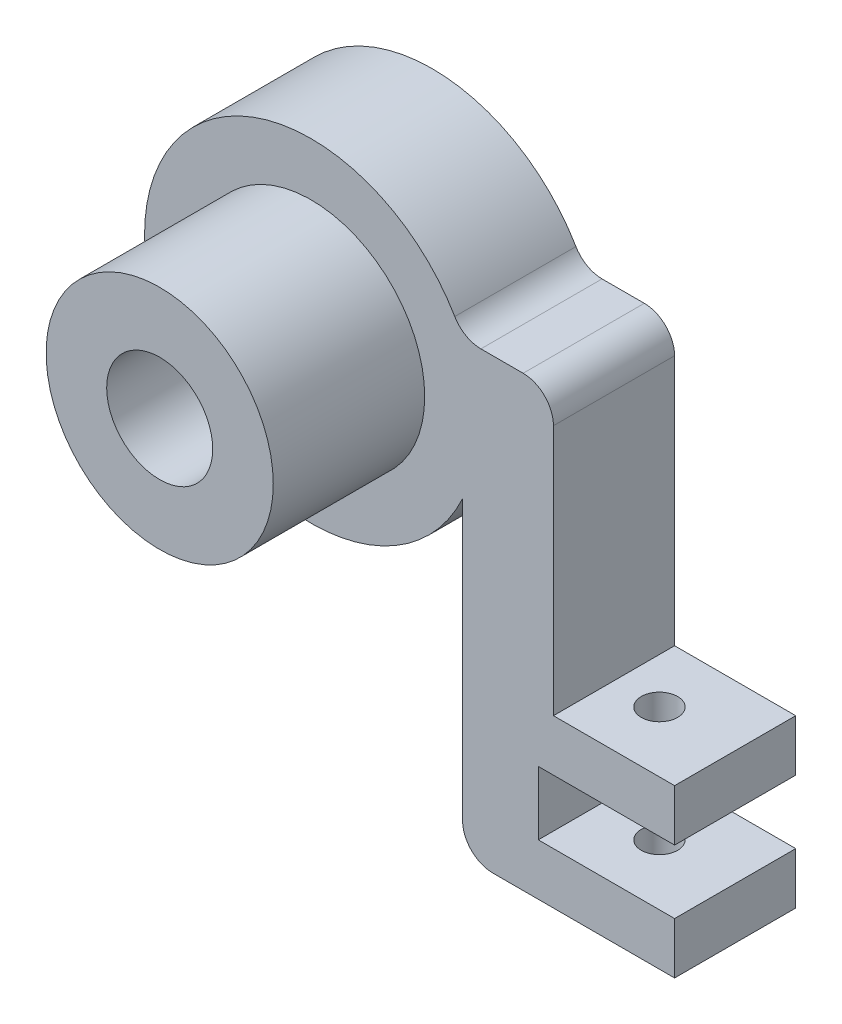
ISO-10303-21;
HEADER;
FILE_DESCRIPTION(('STEP AP214'),'2;1');
FILE_NAME('part.step','',(''),(''),'','','');
FILE_SCHEMA(('AUTOMOTIVE_DESIGN { 1 0 10303 214 1 1 1 1 }'));
ENDSEC;
DATA;
#1=APPLICATION_CONTEXT('core data for automotive mechanical design processes');
#2=APPLICATION_PROTOCOL_DEFINITION('international standard','automotive_design',2000,#1);
#3=PRODUCT_CONTEXT('',#1,'mechanical');
#4=PRODUCT('Part','Part','',(#3));
#5=PRODUCT_RELATED_PRODUCT_CATEGORY('part','',(#4));
#6=PRODUCT_DEFINITION_FORMATION('','',#4);
#7=PRODUCT_DEFINITION_CONTEXT('part definition',#1,'design');
#8=PRODUCT_DEFINITION('design','',#6,#7);
#9=PRODUCT_DEFINITION_SHAPE('','',#8);
#10=(LENGTH_UNIT() NAMED_UNIT(*) SI_UNIT(.MILLI.,.METRE.));
#11=(NAMED_UNIT(*) PLANE_ANGLE_UNIT() SI_UNIT($,.RADIAN.));
#12=(NAMED_UNIT(*) SI_UNIT($,.STERADIAN.) SOLID_ANGLE_UNIT());
#13=UNCERTAINTY_MEASURE_WITH_UNIT(LENGTH_MEASURE(1.E-05),#10,'distance_accuracy_value','');
#14=(GEOMETRIC_REPRESENTATION_CONTEXT(3) GLOBAL_UNCERTAINTY_ASSIGNED_CONTEXT((#13)) GLOBAL_UNIT_ASSIGNED_CONTEXT((#10,
#11,#12)) REPRESENTATION_CONTEXT('',''));
#15=CARTESIAN_POINT('',(0.,0.,0.));
#16=DIRECTION('',(0.,0.,1.));
#17=DIRECTION('',(1.,0.,0.));
#18=AXIS2_PLACEMENT_3D('',#15,#16,#17);
#19=CARTESIAN_POINT('',(35.,-36.,8.));
#20=DIRECTION('',(-1.,0.,0.));
#21=DIRECTION('',(0.,0.,1.));
#22=AXIS2_PLACEMENT_3D('',#19,#20,#21);
#23=PLANE('',#22);
#24=DIRECTION('',(0.,1.,0.));
#25=VECTOR('',#24,1.);
#26=CARTESIAN_POINT('',(35.,-36.,0.));
#27=LINE('',#26,#25);
#28=CARTESIAN_POINT('',(35.,-36.,0.));
#29=VERTEX_POINT('',#28);
#30=CARTESIAN_POINT('',(35.,-32.6,0.));
#31=VERTEX_POINT('',#30);
#32=EDGE_CURVE('E168',#29,#31,#27,.T.);
#33=ORIENTED_EDGE('',*,*,#32,.T.);
#34=DIRECTION('',(0.,0.,-1.));
#35=VECTOR('',#34,1.);
#36=CARTESIAN_POINT('',(35.,-32.6,8.));
#37=LINE('',#36,#35);
#38=CARTESIAN_POINT('',(35.,-32.6,8.));
#39=VERTEX_POINT('',#38);
#40=EDGE_CURVE('E147',#39,#31,#37,.T.);
#41=ORIENTED_EDGE('',*,*,#40,.F.);
#42=DIRECTION('',(0.,1.,0.));
#43=VECTOR('',#42,1.);
#44=CARTESIAN_POINT('',(35.,-36.,8.));
#45=LINE('',#44,#43);
#46=CARTESIAN_POINT('',(35.,-36.,8.));
#47=VERTEX_POINT('',#46);
#48=EDGE_CURVE('E154',#47,#39,#45,.T.);
#49=ORIENTED_EDGE('',*,*,#48,.F.);
#50=DIRECTION('',(0.,0.,-1.));
#51=VECTOR('',#50,1.);
#52=CARTESIAN_POINT('',(35.,-36.,8.));
#53=LINE('',#52,#51);
#54=EDGE_CURVE('E244',#47,#29,#53,.T.);
#55=ORIENTED_EDGE('',*,*,#54,.T.);
#56=EDGE_LOOP('',(#33,#41,#49,#55));
#57=FACE_BOUND('',#56,.T.);
#58=ADVANCED_FACE('F41',(#57),#23,.F.);
#59=CARTESIAN_POINT('',(35.,-32.6,8.));
#60=DIRECTION('',(0.,-1.,0.));
#61=DIRECTION('',(1.,0.,0.));
#62=AXIS2_PLACEMENT_3D('',#59,#60,#61);
#63=PLANE('',#62);
#64=CARTESIAN_POINT('',(30.,-32.6,4.));
#65=DIRECTION('',(0.,-1.,0.));
#66=DIRECTION('',(1.,0.,0.));
#67=AXIS2_PLACEMENT_3D('',#64,#65,#66);
#68=CIRCLE('',#67,1.19999999999999);
#69=CARTESIAN_POINT('',(31.2,-32.6,4.));
#70=VERTEX_POINT('',#69);
#71=EDGE_CURVE('E248',#70,#70,#68,.T.);
#72=ORIENTED_EDGE('',*,*,#71,.T.);
#73=EDGE_LOOP('',(#72));
#74=FACE_BOUND('',#73,.T.);
#75=DIRECTION('',(-1.,0.,0.));
#76=VECTOR('',#75,1.);
#77=CARTESIAN_POINT('',(35.,-32.6,0.));
#78=LINE('',#77,#76);
#79=CARTESIAN_POINT('',(26.,-32.6,0.));
#80=VERTEX_POINT('',#79);
#81=EDGE_CURVE('E247',#31,#80,#78,.T.);
#82=ORIENTED_EDGE('',*,*,#81,.T.);
#83=DIRECTION('',(0.,0.,-1.));
#84=VECTOR('',#83,1.);
#85=CARTESIAN_POINT('',(26.,-32.6,8.));
#86=LINE('',#85,#84);
#87=CARTESIAN_POINT('',(26.,-32.6,8.));
#88=VERTEX_POINT('',#87);
#89=EDGE_CURVE('E150',#88,#80,#86,.T.);
#90=ORIENTED_EDGE('',*,*,#89,.F.);
#91=DIRECTION('',(-1.,0.,0.));
#92=VECTOR('',#91,1.);
#93=CARTESIAN_POINT('',(35.,-32.6,8.));
#94=LINE('',#93,#92);
#95=EDGE_CURVE('E143',#39,#88,#94,.T.);
#96=ORIENTED_EDGE('',*,*,#95,.F.);
#97=ORIENTED_EDGE('',*,*,#40,.T.);
#98=EDGE_LOOP('',(#82,#90,#96,#97));
#99=FACE_BOUND('',#98,.T.);
#100=ADVANCED_FACE('F145',(#74,#99),#63,.F.);
#101=CARTESIAN_POINT('',(26.,-32.6,8.));
#102=DIRECTION('',(-1.,0.,0.));
#103=DIRECTION('',(0.,0.,1.));
#104=AXIS2_PLACEMENT_3D('',#101,#102,#103);
#105=PLANE('',#104);
#106=DIRECTION('',(0.,1.,0.));
#107=VECTOR('',#106,1.);
#108=CARTESIAN_POINT('',(26.,-32.6,0.));
#109=LINE('',#108,#107);
#110=CARTESIAN_POINT('',(26.,-28.4,0.));
#111=VERTEX_POINT('',#110);
#112=EDGE_CURVE('E251',#80,#111,#109,.T.);
#113=ORIENTED_EDGE('',*,*,#112,.T.);
#114=DIRECTION('',(0.,0.,-1.));
#115=VECTOR('',#114,1.);
#116=CARTESIAN_POINT('',(26.,-28.4,8.));
#117=LINE('',#116,#115);
#118=CARTESIAN_POINT('',(26.,-28.4,8.));
#119=VERTEX_POINT('',#118);
#120=EDGE_CURVE('E177',#119,#111,#117,.T.);
#121=ORIENTED_EDGE('',*,*,#120,.F.);
#122=DIRECTION('',(0.,1.,0.));
#123=VECTOR('',#122,1.);
#124=CARTESIAN_POINT('',(26.,-32.6,8.));
#125=LINE('',#124,#123);
#126=EDGE_CURVE('E153',#88,#119,#125,.T.);
#127=ORIENTED_EDGE('',*,*,#126,.F.);
#128=ORIENTED_EDGE('',*,*,#89,.T.);
#129=EDGE_LOOP('',(#113,#121,#127,#128));
#130=FACE_BOUND('',#129,.T.);
#131=ADVANCED_FACE('F406',(#130),#105,.F.);
#132=CARTESIAN_POINT('',(35.,-28.4,8.));
#133=DIRECTION('',(0.,1.,0.));
#134=DIRECTION('',(-1.,0.,0.));
#135=AXIS2_PLACEMENT_3D('',#132,#133,#134);
#136=PLANE('',#135);
#137=CARTESIAN_POINT('',(30.,-28.4,4.));
#138=DIRECTION('',(0.,1.,0.));
#139=DIRECTION('',(-1.,0.,0.));
#140=AXIS2_PLACEMENT_3D('',#137,#138,#139);
#141=CIRCLE('',#140,1.19999999999999);
#142=CARTESIAN_POINT('',(28.8,-28.4,4.));
#143=VERTEX_POINT('',#142);
#144=EDGE_CURVE('E328',#143,#143,#141,.T.);
#145=ORIENTED_EDGE('',*,*,#144,.T.);
#146=EDGE_LOOP('',(#145));
#147=FACE_BOUND('',#146,.T.);
#148=DIRECTION('',(1.,0.,0.));
#149=VECTOR('',#148,1.);
#150=CARTESIAN_POINT('',(35.,-28.4,0.));
#151=LINE('',#150,#149);
#152=CARTESIAN_POINT('',(35.,-28.4,0.));
#153=VERTEX_POINT('',#152);
#154=EDGE_CURVE('E254',#111,#153,#151,.T.);
#155=ORIENTED_EDGE('',*,*,#154,.T.);
#156=DIRECTION('',(0.,0.,-1.));
#157=VECTOR('',#156,1.);
#158=CARTESIAN_POINT('',(35.,-28.4,8.));
#159=LINE('',#158,#157);
#160=CARTESIAN_POINT('',(35.,-28.4,8.));
#161=VERTEX_POINT('',#160);
#162=EDGE_CURVE('E286',#161,#153,#159,.T.);
#163=ORIENTED_EDGE('',*,*,#162,.F.);
#164=DIRECTION('',(1.,0.,0.));
#165=VECTOR('',#164,1.);
#166=CARTESIAN_POINT('',(35.,-28.4,8.));
#167=LINE('',#166,#165);
#168=EDGE_CURVE('E297',#119,#161,#167,.T.);
#169=ORIENTED_EDGE('',*,*,#168,.F.);
#170=ORIENTED_EDGE('',*,*,#120,.T.);
#171=EDGE_LOOP('',(#155,#163,#169,#170));
#172=FACE_BOUND('',#171,.T.);
#173=ADVANCED_FACE('F295',(#147,#172),#136,.F.);
#174=CARTESIAN_POINT('',(35.,-28.4,8.));
#175=DIRECTION('',(-1.,0.,0.));
#176=DIRECTION('',(0.,0.,1.));
#177=AXIS2_PLACEMENT_3D('',#174,#175,#176);
#178=PLANE('',#177);
#179=DIRECTION('',(0.,1.,0.));
#180=VECTOR('',#179,1.);
#181=CARTESIAN_POINT('',(35.,-28.4,0.));
#182=LINE('',#181,#180);
#183=CARTESIAN_POINT('',(35.,-25.,0.));
#184=VERTEX_POINT('',#183);
#185=EDGE_CURVE('E257',#153,#184,#182,.T.);
#186=ORIENTED_EDGE('',*,*,#185,.T.);
#187=DIRECTION('',(0.,0.,-1.));
#188=VECTOR('',#187,1.);
#189=CARTESIAN_POINT('',(35.,-25.,8.));
#190=LINE('',#189,#188);
#191=CARTESIAN_POINT('',(35.,-25.,8.));
#192=VERTEX_POINT('',#191);
#193=EDGE_CURVE('E282',#192,#184,#190,.T.);
#194=ORIENTED_EDGE('',*,*,#193,.F.);
#195=DIRECTION('',(0.,1.,0.));
#196=VECTOR('',#195,1.);
#197=CARTESIAN_POINT('',(35.,-28.4,8.));
#198=LINE('',#197,#196);
#199=EDGE_CURVE('E315',#161,#192,#198,.T.);
#200=ORIENTED_EDGE('',*,*,#199,.F.);
#201=ORIENTED_EDGE('',*,*,#162,.T.);
#202=EDGE_LOOP('',(#186,#194,#200,#201));
#203=FACE_BOUND('',#202,.T.);
#204=ADVANCED_FACE('F305',(#203),#178,.F.);
#205=CARTESIAN_POINT('',(35.,-25.,8.));
#206=DIRECTION('',(0.,-1.,0.));
#207=DIRECTION('',(0.,0.,-1.));
#208=AXIS2_PLACEMENT_3D('',#205,#206,#207);
#209=PLANE('',#208);
#210=CARTESIAN_POINT('',(30.,-25.,4.));
#211=DIRECTION('',(0.,1.,0.));
#212=DIRECTION('',(0.,0.,1.));
#213=AXIS2_PLACEMENT_3D('',#210,#211,#212);
#214=CIRCLE('',#213,1.19999999999999);
#215=CARTESIAN_POINT('',(30.,-25.,5.19999999999999));
#216=VERTEX_POINT('',#215);
#217=EDGE_CURVE('E333',#216,#216,#214,.T.);
#218=ORIENTED_EDGE('',*,*,#217,.F.);
#219=EDGE_LOOP('',(#218));
#220=FACE_BOUND('',#219,.T.);
#221=DIRECTION('',(-1.,0.,0.));
#222=VECTOR('',#221,1.);
#223=CARTESIAN_POINT('',(35.,-25.,0.));
#224=LINE('',#223,#222);
#225=CARTESIAN_POINT('',(27.,-25.,0.));
#226=VERTEX_POINT('',#225);
#227=EDGE_CURVE('E260',#184,#226,#224,.T.);
#228=ORIENTED_EDGE('',*,*,#227,.T.);
#229=DIRECTION('',(0.,0.,-1.));
#230=VECTOR('',#229,1.);
#231=CARTESIAN_POINT('',(27.,-25.,8.));
#232=LINE('',#231,#230);
#233=CARTESIAN_POINT('',(27.,-25.,8.));
#234=VERTEX_POINT('',#233);
#235=EDGE_CURVE('E278',#234,#226,#232,.T.);
#236=ORIENTED_EDGE('',*,*,#235,.F.);
#237=DIRECTION('',(-1.,0.,0.));
#238=VECTOR('',#237,1.);
#239=CARTESIAN_POINT('',(35.,-25.,8.));
#240=LINE('',#239,#238);
#241=EDGE_CURVE('E311',#192,#234,#240,.T.);
#242=ORIENTED_EDGE('',*,*,#241,.F.);
#243=ORIENTED_EDGE('',*,*,#193,.T.);
#244=EDGE_LOOP('',(#228,#236,#242,#243));
#245=FACE_BOUND('',#244,.T.);
#246=ADVANCED_FACE('F309',(#220,#245),#209,.F.);
#247=CARTESIAN_POINT('',(27.,-6.41742430504416,8.));
#248=DIRECTION('',(-1.,0.,0.));
#249=DIRECTION('',(0.,-1.,0.));
#250=AXIS2_PLACEMENT_3D('',#247,#248,#249);
#251=PLANE('',#250);
#252=DIRECTION('',(0.,1.,0.));
#253=VECTOR('',#252,1.);
#254=CARTESIAN_POINT('',(27.,-6.41742430504416,0.));
#255=LINE('',#254,#253);
#256=CARTESIAN_POINT('',(27.,-8.41742430504416,0.));
#257=VERTEX_POINT('',#256);
#258=EDGE_CURVE('E221',#226,#257,#255,.T.);
#259=ORIENTED_EDGE('',*,*,#258,.T.);
#260=DIRECTION('',(0.,0.,-1.));
#261=VECTOR('',#260,1.);
#262=CARTESIAN_POINT('',(27.,-8.41742430504416,8.));
#263=LINE('',#262,#261);
#264=CARTESIAN_POINT('',(27.,-8.41742430504416,8.));
#265=VERTEX_POINT('',#264);
#266=EDGE_CURVE('E205',#257,#265,#263,.F.);
#267=ORIENTED_EDGE('',*,*,#266,.T.);
#268=DIRECTION('',(0.,1.,0.));
#269=VECTOR('',#268,1.);
#270=CARTESIAN_POINT('',(27.,-6.41742430504416,8.));
#271=LINE('',#270,#269);
#272=EDGE_CURVE('E238',#234,#265,#271,.T.);
#273=ORIENTED_EDGE('',*,*,#272,.F.);
#274=ORIENTED_EDGE('',*,*,#235,.T.);
#275=EDGE_LOOP('',(#259,#267,#273,#274));
#276=FACE_BOUND('',#275,.T.);
#277=ADVANCED_FACE('F428',(#276),#251,.F.);
#278=CARTESIAN_POINT('',(21.,-6.41742430504416,8.));
#279=DIRECTION('',(0.,-1.,0.));
#280=DIRECTION('',(0.,0.,-1.));
#281=AXIS2_PLACEMENT_3D('',#278,#279,#280);
#282=PLANE('',#281);
#283=DIRECTION('',(-1.,0.,0.));
#284=VECTOR('',#283,1.);
#285=CARTESIAN_POINT('',(21.,-6.41742430504416,0.));
#286=LINE('',#285,#284);
#287=CARTESIAN_POINT('',(25.,-6.41742430504416,0.));
#288=VERTEX_POINT('',#287);
#289=CARTESIAN_POINT('',(22.2102496502164,-6.41742430504416,0.));
#290=VERTEX_POINT('',#289);
#291=EDGE_CURVE('E213',#288,#290,#286,.T.);
#292=ORIENTED_EDGE('',*,*,#291,.T.);
#293=DIRECTION('',(0.,0.,1.));
#294=VECTOR('',#293,1.);
#295=CARTESIAN_POINT('',(22.2102496502164,-6.41742430504416,8.));
#296=LINE('',#295,#294);
#297=CARTESIAN_POINT('',(22.2102496502164,-6.41742430504416,8.));
#298=VERTEX_POINT('',#297);
#299=EDGE_CURVE('E63',#290,#298,#296,.T.);
#300=ORIENTED_EDGE('',*,*,#299,.T.);
#301=DIRECTION('',(-1.,0.,0.));
#302=VECTOR('',#301,1.);
#303=CARTESIAN_POINT('',(21.,-6.41742430504416,8.));
#304=LINE('',#303,#302);
#305=CARTESIAN_POINT('',(25.,-6.41742430504416,8.));
#306=VERTEX_POINT('',#305);
#307=EDGE_CURVE('E233',#306,#298,#304,.T.);
#308=ORIENTED_EDGE('',*,*,#307,.F.);
#309=DIRECTION('',(0.,0.,-1.));
#310=VECTOR('',#309,1.);
#311=CARTESIAN_POINT('',(25.,-6.41742430504416,8.));
#312=LINE('',#311,#310);
#313=EDGE_CURVE('E199',#306,#288,#312,.T.);
#314=ORIENTED_EDGE('',*,*,#313,.T.);
#315=EDGE_LOOP('',(#292,#300,#308,#314));
#316=FACE_BOUND('',#315,.T.);
#317=ADVANCED_FACE('F218',(#316),#282,.F.);
#318=CARTESIAN_POINT('',(11.,-11.,8.));
#319=DIRECTION('',(0.,0.,-1.));
#320=DIRECTION('',(-1.,0.,0.));
#321=AXIS2_PLACEMENT_3D('',#318,#319,#320);
#322=CYLINDRICAL_SURFACE('',#321,11.);
#323=CARTESIAN_POINT('',(11.,-11.,8.));
#324=DIRECTION('',(0.,0.,1.));
#325=DIRECTION('',(1.,0.,0.));
#326=AXIS2_PLACEMENT_3D('',#323,#324,#325);
#327=CIRCLE('',#326,11.);
#328=CARTESIAN_POINT('',(20.4855958578754,-5.43012825811429,8.));
#329=VERTEX_POINT('',#328);
#330=CARTESIAN_POINT('',(21.,-15.5825756949558,8.));
#331=VERTEX_POINT('',#330);
#332=EDGE_CURVE('E228',#329,#331,#327,.T.);
#333=ORIENTED_EDGE('',*,*,#332,.F.);
#334=DIRECTION('',(0.,0.,-1.));
#335=VECTOR('',#334,1.);
#336=CARTESIAN_POINT('',(20.4855958578754,-5.43012825811429,8.));
#337=LINE('',#336,#335);
#338=CARTESIAN_POINT('',(20.4855958578754,-5.43012825811429,0.));
#339=VERTEX_POINT('',#338);
#340=EDGE_CURVE('E195',#329,#339,#337,.T.);
#341=ORIENTED_EDGE('',*,*,#340,.T.);
#342=CARTESIAN_POINT('',(11.,-11.,0.));
#343=DIRECTION('',(0.,0.,1.));
#344=DIRECTION('',(1.,0.,0.));
#345=AXIS2_PLACEMENT_3D('',#342,#343,#344);
#346=CIRCLE('',#345,11.);
#347=CARTESIAN_POINT('',(21.,-15.5825756949558,0.));
#348=VERTEX_POINT('',#347);
#349=EDGE_CURVE('E215',#339,#348,#346,.T.);
#350=ORIENTED_EDGE('',*,*,#349,.T.);
#351=DIRECTION('',(0.,0.,-1.));
#352=VECTOR('',#351,1.);
#353=CARTESIAN_POINT('',(21.,-15.5825756949558,8.));
#354=LINE('',#353,#352);
#355=EDGE_CURVE('E229',#331,#348,#354,.T.);
#356=ORIENTED_EDGE('',*,*,#355,.F.);
#357=EDGE_LOOP('',(#333,#341,#350,#356));
#358=FACE_BOUND('',#357,.T.);
#359=ADVANCED_FACE('F225',(#358),#322,.T.);
#360=CARTESIAN_POINT('',(21.,-36.,8.));
#361=DIRECTION('',(1.,0.,0.));
#362=DIRECTION('',(0.,1.,0.));
#363=AXIS2_PLACEMENT_3D('',#360,#361,#362);
#364=PLANE('',#363);
#365=DIRECTION('',(0.,-1.,0.));
#366=VECTOR('',#365,1.);
#367=CARTESIAN_POINT('',(21.,-36.,0.));
#368=LINE('',#367,#366);
#369=CARTESIAN_POINT('',(21.,-34.,0.));
#370=VERTEX_POINT('',#369);
#371=EDGE_CURVE('E268',#348,#370,#368,.T.);
#372=ORIENTED_EDGE('',*,*,#371,.T.);
#373=DIRECTION('',(0.,0.,-1.));
#374=VECTOR('',#373,1.);
#375=CARTESIAN_POINT('',(21.,-34.,8.));
#376=LINE('',#375,#374);
#377=CARTESIAN_POINT('',(21.,-34.,8.));
#378=VERTEX_POINT('',#377);
#379=EDGE_CURVE('E186',#370,#378,#376,.F.);
#380=ORIENTED_EDGE('',*,*,#379,.T.);
#381=DIRECTION('',(0.,-1.,0.));
#382=VECTOR('',#381,1.);
#383=CARTESIAN_POINT('',(21.,-36.,8.));
#384=LINE('',#383,#382);
#385=EDGE_CURVE('E232',#331,#378,#384,.T.);
#386=ORIENTED_EDGE('',*,*,#385,.F.);
#387=ORIENTED_EDGE('',*,*,#355,.T.);
#388=EDGE_LOOP('',(#372,#380,#386,#387));
#389=FACE_BOUND('',#388,.T.);
#390=ADVANCED_FACE('F499',(#389),#364,.F.);
#391=CARTESIAN_POINT('',(35.,-36.,8.));
#392=DIRECTION('',(0.,1.,0.));
#393=DIRECTION('',(0.,0.,1.));
#394=AXIS2_PLACEMENT_3D('',#391,#392,#393);
#395=PLANE('',#394);
#396=CARTESIAN_POINT('',(30.,-36.,4.));
#397=DIRECTION('',(0.,1.,0.));
#398=DIRECTION('',(0.,0.,1.));
#399=AXIS2_PLACEMENT_3D('',#396,#397,#398);
#400=CIRCLE('',#399,1.19999999999999);
#401=CARTESIAN_POINT('',(30.,-36.,5.19999999999999));
#402=VERTEX_POINT('',#401);
#403=EDGE_CURVE('E332',#402,#402,#400,.F.);
#404=ORIENTED_EDGE('',*,*,#403,.F.);
#405=EDGE_LOOP('',(#404));
#406=FACE_BOUND('',#405,.T.);
#407=DIRECTION('',(1.,0.,0.));
#408=VECTOR('',#407,1.);
#409=CARTESIAN_POINT('',(35.,-36.,8.));
#410=LINE('',#409,#408);
#411=CARTESIAN_POINT('',(23.,-36.,8.));
#412=VERTEX_POINT('',#411);
#413=EDGE_CURVE('E160',#412,#47,#410,.T.);
#414=ORIENTED_EDGE('',*,*,#413,.F.);
#415=DIRECTION('',(0.,0.,-1.));
#416=VECTOR('',#415,1.);
#417=CARTESIAN_POINT('',(23.,-36.,8.));
#418=LINE('',#417,#416);
#419=CARTESIAN_POINT('',(23.,-36.,0.));
#420=VERTEX_POINT('',#419);
#421=EDGE_CURVE('E170',#412,#420,#418,.T.);
#422=ORIENTED_EDGE('',*,*,#421,.T.);
#423=DIRECTION('',(1.,0.,0.));
#424=VECTOR('',#423,1.);
#425=CARTESIAN_POINT('',(35.,-36.,0.));
#426=LINE('',#425,#424);
#427=EDGE_CURVE('E165',#420,#29,#426,.T.);
#428=ORIENTED_EDGE('',*,*,#427,.T.);
#429=ORIENTED_EDGE('',*,*,#54,.F.);
#430=EDGE_LOOP('',(#414,#422,#428,#429));
#431=FACE_BOUND('',#430,.T.);
#432=ADVANCED_FACE('F507',(#406,#431),#395,.F.);
#433=CARTESIAN_POINT('',(11.,-11.,8.));
#434=DIRECTION('',(0.,0.,1.));
#435=DIRECTION('',(1.,0.,0.));
#436=AXIS2_PLACEMENT_3D('',#433,#434,#435);
#437=PLANE('',#436);
#438=CARTESIAN_POINT('',(11.,-11.,8.));
#439=DIRECTION('',(0.,0.,1.));
#440=DIRECTION('',(1.,0.,0.));
#441=AXIS2_PLACEMENT_3D('',#438,#439,#440);
#442=CIRCLE('',#441,7.5);
#443=CARTESIAN_POINT('',(18.5,-11.,8.));
#444=VERTEX_POINT('',#443);
#445=EDGE_CURVE('E341',#444,#444,#442,.T.);
#446=ORIENTED_EDGE('',*,*,#445,.F.);
#447=EDGE_LOOP('',(#446));
#448=FACE_BOUND('',#447,.T.);
#449=ORIENTED_EDGE('',*,*,#385,.T.);
#450=CARTESIAN_POINT('',(23.,-34.,8.));
#451=DIRECTION('',(0.,0.,1.));
#452=DIRECTION('',(1.,0.,0.));
#453=AXIS2_PLACEMENT_3D('',#450,#451,#452);
#454=CIRCLE('',#453,2.);
#455=EDGE_CURVE('E192',#378,#412,#454,.T.);
#456=ORIENTED_EDGE('',*,*,#455,.T.);
#457=ORIENTED_EDGE('',*,*,#413,.T.);
#458=ORIENTED_EDGE('',*,*,#48,.T.);
#459=ORIENTED_EDGE('',*,*,#95,.T.);
#460=ORIENTED_EDGE('',*,*,#126,.T.);
#461=ORIENTED_EDGE('',*,*,#168,.T.);
#462=ORIENTED_EDGE('',*,*,#199,.T.);
#463=ORIENTED_EDGE('',*,*,#241,.T.);
#464=ORIENTED_EDGE('',*,*,#272,.T.);
#465=CARTESIAN_POINT('',(25.,-8.41742430504416,8.));
#466=DIRECTION('',(0.,0.,1.));
#467=DIRECTION('',(1.,0.,0.));
#468=AXIS2_PLACEMENT_3D('',#465,#466,#467);
#469=CIRCLE('',#468,2.);
#470=EDGE_CURVE('E189',#265,#306,#469,.T.);
#471=ORIENTED_EDGE('',*,*,#470,.T.);
#472=ORIENTED_EDGE('',*,*,#307,.T.);
#473=CARTESIAN_POINT('',(22.2102496502164,-4.41742430504416,8.));
#474=DIRECTION('',(0.,0.,1.));
#475=DIRECTION('',(1.,0.,0.));
#476=AXIS2_PLACEMENT_3D('',#473,#474,#475);
#477=CIRCLE('',#476,2.);
#478=EDGE_CURVE('E12',#298,#329,#477,.F.);
#479=ORIENTED_EDGE('',*,*,#478,.T.);
#480=ORIENTED_EDGE('',*,*,#332,.T.);
#481=EDGE_LOOP('',(#449,#456,#457,#458,#459,#460,#461,#462,#463,#464,#471,#472,#479,#480));
#482=FACE_BOUND('',#481,.T.);
#483=ADVANCED_FACE('F158',(#448,#482),#437,.T.);
#484=CARTESIAN_POINT('',(11.,-11.,0.));
#485=DIRECTION('',(0.,0.,1.));
#486=DIRECTION('',(1.,0.,0.));
#487=AXIS2_PLACEMENT_3D('',#484,#485,#486);
#488=PLANE('',#487);
#489=CARTESIAN_POINT('',(11.,-11.,0.));
#490=DIRECTION('',(0.,0.,-1.));
#491=DIRECTION('',(-1.,0.,0.));
#492=AXIS2_PLACEMENT_3D('',#489,#490,#491);
#493=CIRCLE('',#492,3.5);
#494=CARTESIAN_POINT('',(7.5,-11.,0.));
#495=VERTEX_POINT('',#494);
#496=EDGE_CURVE('E368',#495,#495,#493,.T.);
#497=ORIENTED_EDGE('',*,*,#496,.F.);
#498=EDGE_LOOP('',(#497));
#499=FACE_BOUND('',#498,.T.);
#500=CARTESIAN_POINT('',(11.,-3.5,0.));
#501=DIRECTION('',(0.,0.,-1.));
#502=DIRECTION('',(-1.,0.,0.));
#503=AXIS2_PLACEMENT_3D('',#500,#501,#502);
#504=CIRCLE('',#503,1.);
#505=CARTESIAN_POINT('',(10.,-3.5,0.));
#506=VERTEX_POINT('',#505);
#507=EDGE_CURVE('E353',#506,#506,#504,.T.);
#508=ORIENTED_EDGE('',*,*,#507,.F.);
#509=EDGE_LOOP('',(#508));
#510=FACE_BOUND('',#509,.T.);
#511=CARTESIAN_POINT('',(11.,-18.5,0.));
#512=DIRECTION('',(0.,0.,-1.));
#513=DIRECTION('',(-1.,0.,0.));
#514=AXIS2_PLACEMENT_3D('',#511,#512,#513);
#515=CIRCLE('',#514,1.);
#516=CARTESIAN_POINT('',(10.,-18.5,0.));
#517=VERTEX_POINT('',#516);
#518=EDGE_CURVE('E354',#517,#517,#515,.T.);
#519=ORIENTED_EDGE('',*,*,#518,.F.);
#520=EDGE_LOOP('',(#519));
#521=FACE_BOUND('',#520,.T.);
#522=ORIENTED_EDGE('',*,*,#427,.F.);
#523=CARTESIAN_POINT('',(23.,-34.,0.));
#524=DIRECTION('',(0.,0.,1.));
#525=DIRECTION('',(1.,0.,0.));
#526=AXIS2_PLACEMENT_3D('',#523,#524,#525);
#527=CIRCLE('',#526,2.);
#528=EDGE_CURVE('E183',#420,#370,#527,.F.);
#529=ORIENTED_EDGE('',*,*,#528,.T.);
#530=ORIENTED_EDGE('',*,*,#371,.F.);
#531=ORIENTED_EDGE('',*,*,#349,.F.);
#532=CARTESIAN_POINT('',(22.2102496502164,-4.41742430504416,0.));
#533=DIRECTION('',(0.,0.,1.));
#534=DIRECTION('',(1.,0.,0.));
#535=AXIS2_PLACEMENT_3D('',#532,#533,#534);
#536=CIRCLE('',#535,2.);
#537=EDGE_CURVE('E50',#339,#290,#536,.T.);
#538=ORIENTED_EDGE('',*,*,#537,.T.);
#539=ORIENTED_EDGE('',*,*,#291,.F.);
#540=CARTESIAN_POINT('',(25.,-8.41742430504416,0.));
#541=DIRECTION('',(0.,0.,1.));
#542=DIRECTION('',(1.,0.,0.));
#543=AXIS2_PLACEMENT_3D('',#540,#541,#542);
#544=CIRCLE('',#543,2.);
#545=EDGE_CURVE('E175',#288,#257,#544,.F.);
#546=ORIENTED_EDGE('',*,*,#545,.T.);
#547=ORIENTED_EDGE('',*,*,#258,.F.);
#548=ORIENTED_EDGE('',*,*,#227,.F.);
#549=ORIENTED_EDGE('',*,*,#185,.F.);
#550=ORIENTED_EDGE('',*,*,#154,.F.);
#551=ORIENTED_EDGE('',*,*,#112,.F.);
#552=ORIENTED_EDGE('',*,*,#81,.F.);
#553=ORIENTED_EDGE('',*,*,#32,.F.);
#554=EDGE_LOOP('',(#522,#529,#530,#531,#538,#539,#546,#547,#548,#549,#550,#551,#552,#553));
#555=FACE_BOUND('',#554,.T.);
#556=ADVANCED_FACE('F212',(#499,#510,#521,#555),#488,.F.);
#557=CARTESIAN_POINT('',(30.,-25.,4.));
#558=DIRECTION('',(0.,1.,0.));
#559=DIRECTION('',(0.,0.,1.));
#560=AXIS2_PLACEMENT_3D('',#557,#558,#559);
#561=CYLINDRICAL_SURFACE('',#560,1.19999999999999);
#562=ORIENTED_EDGE('',*,*,#403,.T.);
#563=EDGE_LOOP('',(#562));
#564=FACE_BOUND('',#563,.T.);
#565=ORIENTED_EDGE('',*,*,#71,.F.);
#566=EDGE_LOOP('',(#565));
#567=FACE_BOUND('',#566,.T.);
#568=ADVANCED_FACE('F378',(#564,#567),#561,.F.);
#569=ORIENTED_EDGE('',*,*,#217,.T.);
#570=EDGE_LOOP('',(#569));
#571=FACE_BOUND('',#570,.T.);
#572=ORIENTED_EDGE('',*,*,#144,.F.);
#573=EDGE_LOOP('',(#572));
#574=FACE_BOUND('',#573,.T.);
#575=ADVANCED_FACE('F413',(#571,#574),#561,.F.);
#576=CARTESIAN_POINT('',(23.,-34.,8.));
#577=DIRECTION('',(0.,0.,-1.));
#578=DIRECTION('',(-1.,0.,0.));
#579=AXIS2_PLACEMENT_3D('',#576,#577,#578);
#580=CYLINDRICAL_SURFACE('',#579,2.);
#581=ORIENTED_EDGE('',*,*,#455,.F.);
#582=ORIENTED_EDGE('',*,*,#379,.F.);
#583=ORIENTED_EDGE('',*,*,#528,.F.);
#584=ORIENTED_EDGE('',*,*,#421,.F.);
#585=EDGE_LOOP('',(#581,#582,#583,#584));
#586=FACE_BOUND('',#585,.T.);
#587=ADVANCED_FACE('F411',(#586),#580,.T.);
#588=CARTESIAN_POINT('',(22.2102496502164,-4.41742430504416,8.));
#589=DIRECTION('',(0.,0.,-1.));
#590=DIRECTION('',(-1.,0.,0.));
#591=AXIS2_PLACEMENT_3D('',#588,#589,#590);
#592=CYLINDRICAL_SURFACE('',#591,2.);
#593=ORIENTED_EDGE('',*,*,#478,.F.);
#594=ORIENTED_EDGE('',*,*,#299,.F.);
#595=ORIENTED_EDGE('',*,*,#537,.F.);
#596=ORIENTED_EDGE('',*,*,#340,.F.);
#597=EDGE_LOOP('',(#593,#594,#595,#596));
#598=FACE_BOUND('',#597,.T.);
#599=ADVANCED_FACE('F223',(#598),#592,.F.);
#600=CARTESIAN_POINT('',(25.,-8.41742430504416,8.));
#601=DIRECTION('',(0.,0.,-1.));
#602=DIRECTION('',(-1.,0.,0.));
#603=AXIS2_PLACEMENT_3D('',#600,#601,#602);
#604=CYLINDRICAL_SURFACE('',#603,2.);
#605=ORIENTED_EDGE('',*,*,#470,.F.);
#606=ORIENTED_EDGE('',*,*,#266,.F.);
#607=ORIENTED_EDGE('',*,*,#545,.F.);
#608=ORIENTED_EDGE('',*,*,#313,.F.);
#609=EDGE_LOOP('',(#605,#606,#607,#608));
#610=FACE_BOUND('',#609,.T.);
#611=ADVANCED_FACE('F43',(#610),#604,.T.);
#612=CARTESIAN_POINT('',(11.,-11.,18.));
#613=DIRECTION('',(0.,0.,-1.));
#614=DIRECTION('',(-1.,0.,0.));
#615=AXIS2_PLACEMENT_3D('',#612,#613,#614);
#616=CYLINDRICAL_SURFACE('',#615,7.5);
#617=CARTESIAN_POINT('',(11.,-11.,18.));
#618=DIRECTION('',(0.,0.,1.));
#619=DIRECTION('',(1.,0.,0.));
#620=AXIS2_PLACEMENT_3D('',#617,#618,#619);
#621=CIRCLE('',#620,7.5);
#622=CARTESIAN_POINT('',(18.5,-11.,18.));
#623=VERTEX_POINT('',#622);
#624=EDGE_CURVE('E337',#623,#623,#621,.T.);
#625=ORIENTED_EDGE('',*,*,#624,.F.);
#626=EDGE_LOOP('',(#625));
#627=FACE_BOUND('',#626,.T.);
#628=ORIENTED_EDGE('',*,*,#445,.T.);
#629=EDGE_LOOP('',(#628));
#630=FACE_BOUND('',#629,.T.);
#631=ADVANCED_FACE('F398',(#627,#630),#616,.T.);
#632=CARTESIAN_POINT('',(11.,-11.,18.));
#633=DIRECTION('',(0.,0.,1.));
#634=DIRECTION('',(1.,0.,0.));
#635=AXIS2_PLACEMENT_3D('',#632,#633,#634);
#636=PLANE('',#635);
#637=CARTESIAN_POINT('',(11.,-11.,18.));
#638=DIRECTION('',(0.,0.,1.));
#639=DIRECTION('',(1.,0.,0.));
#640=AXIS2_PLACEMENT_3D('',#637,#638,#639);
#641=CIRCLE('',#640,3.5);
#642=CARTESIAN_POINT('',(14.5,-11.,18.));
#643=VERTEX_POINT('',#642);
#644=EDGE_CURVE('E358',#643,#643,#641,.F.);
#645=ORIENTED_EDGE('',*,*,#644,.T.);
#646=EDGE_LOOP('',(#645));
#647=FACE_BOUND('',#646,.T.);
#648=ORIENTED_EDGE('',*,*,#624,.T.);
#649=EDGE_LOOP('',(#648));
#650=FACE_BOUND('',#649,.T.);
#651=ADVANCED_FACE('F393',(#647,#650),#636,.T.);
#652=CARTESIAN_POINT('',(11.,-11.,6.));
#653=DIRECTION('',(0.,0.,1.));
#654=DIRECTION('',(1.,0.,0.));
#655=AXIS2_PLACEMENT_3D('',#652,#653,#654);
#656=PLANE('',#655);
#657=CARTESIAN_POINT('',(11.,-18.5,6.));
#658=DIRECTION('',(0.,0.,1.));
#659=DIRECTION('',(1.,0.,0.));
#660=AXIS2_PLACEMENT_3D('',#657,#658,#659);
#661=CIRCLE('',#660,1.);
#662=CARTESIAN_POINT('',(12.,-18.5,6.));
#663=VERTEX_POINT('',#662);
#664=EDGE_CURVE('E349',#663,#663,#661,.F.);
#665=ORIENTED_EDGE('',*,*,#664,.T.);
#666=EDGE_LOOP('',(#665));
#667=FACE_BOUND('',#666,.T.);
#668=ADVANCED_FACE('F388',(#667),#656,.F.);
#669=CARTESIAN_POINT('',(11.,-18.5,10.8284271247462));
#670=DIRECTION('',(0.,0.,-1.));
#671=DIRECTION('',(-1.,0.,0.));
#672=AXIS2_PLACEMENT_3D('',#669,#670,#671);
#673=CYLINDRICAL_SURFACE('',#672,1.);
#674=ORIENTED_EDGE('',*,*,#518,.T.);
#675=EDGE_LOOP('',(#674));
#676=FACE_BOUND('',#675,.T.);
#677=ORIENTED_EDGE('',*,*,#664,.F.);
#678=EDGE_LOOP('',(#677));
#679=FACE_BOUND('',#678,.T.);
#680=ADVANCED_FACE('F384',(#676,#679),#673,.F.);
#681=CARTESIAN_POINT('',(11.,-11.,6.));
#682=DIRECTION('',(0.,0.,1.));
#683=DIRECTION('',(1.,0.,0.));
#684=AXIS2_PLACEMENT_3D('',#681,#682,#683);
#685=PLANE('',#684);
#686=CARTESIAN_POINT('',(11.,-3.5,6.));
#687=DIRECTION('',(0.,0.,1.));
#688=DIRECTION('',(1.,0.,0.));
#689=AXIS2_PLACEMENT_3D('',#686,#687,#688);
#690=CIRCLE('',#689,1.);
#691=CARTESIAN_POINT('',(12.,-3.5,6.));
#692=VERTEX_POINT('',#691);
#693=EDGE_CURVE('E345',#692,#692,#690,.F.);
#694=ORIENTED_EDGE('',*,*,#693,.T.);
#695=EDGE_LOOP('',(#694));
#696=FACE_BOUND('',#695,.T.);
#697=ADVANCED_FACE('F387',(#696),#685,.F.);
#698=CARTESIAN_POINT('',(11.,-3.5,10.8284271247462));
#699=DIRECTION('',(0.,0.,-1.));
#700=DIRECTION('',(-1.,0.,0.));
#701=AXIS2_PLACEMENT_3D('',#698,#699,#700);
#702=CYLINDRICAL_SURFACE('',#701,1.);
#703=ORIENTED_EDGE('',*,*,#507,.T.);
#704=EDGE_LOOP('',(#703));
#705=FACE_BOUND('',#704,.T.);
#706=ORIENTED_EDGE('',*,*,#693,.F.);
#707=EDGE_LOOP('',(#706));
#708=FACE_BOUND('',#707,.T.);
#709=ADVANCED_FACE('F565',(#705,#708),#702,.F.);
#710=CARTESIAN_POINT('',(11.,-11.,27.8994949366117));
#711=DIRECTION('',(0.,0.,-1.));
#712=DIRECTION('',(-1.,0.,0.));
#713=AXIS2_PLACEMENT_3D('',#710,#711,#712);
#714=CYLINDRICAL_SURFACE('',#713,3.5);
#715=ORIENTED_EDGE('',*,*,#496,.T.);
#716=EDGE_LOOP('',(#715));
#717=FACE_BOUND('',#716,.T.);
#718=ORIENTED_EDGE('',*,*,#644,.F.);
#719=EDGE_LOOP('',(#718));
#720=FACE_BOUND('',#719,.T.);
#721=ADVANCED_FACE('F373',(#717,#720),#714,.F.);
#722=CLOSED_SHELL('',(#58,#100,#131,#173,#204,#246,#277,#317,#359,#390,#432,#483,#556,#568,#575,
#587,#599,#611,#631,#651,#668,#680,#697,#709,#721));
#723=MANIFOLD_SOLID_BREP('B2',#722);
#724=ADVANCED_BREP_SHAPE_REPRESENTATION('',(#18,#723),#14);
#725=SHAPE_DEFINITION_REPRESENTATION(#9,#724);
ENDSEC;
END-ISO-10303-21;
